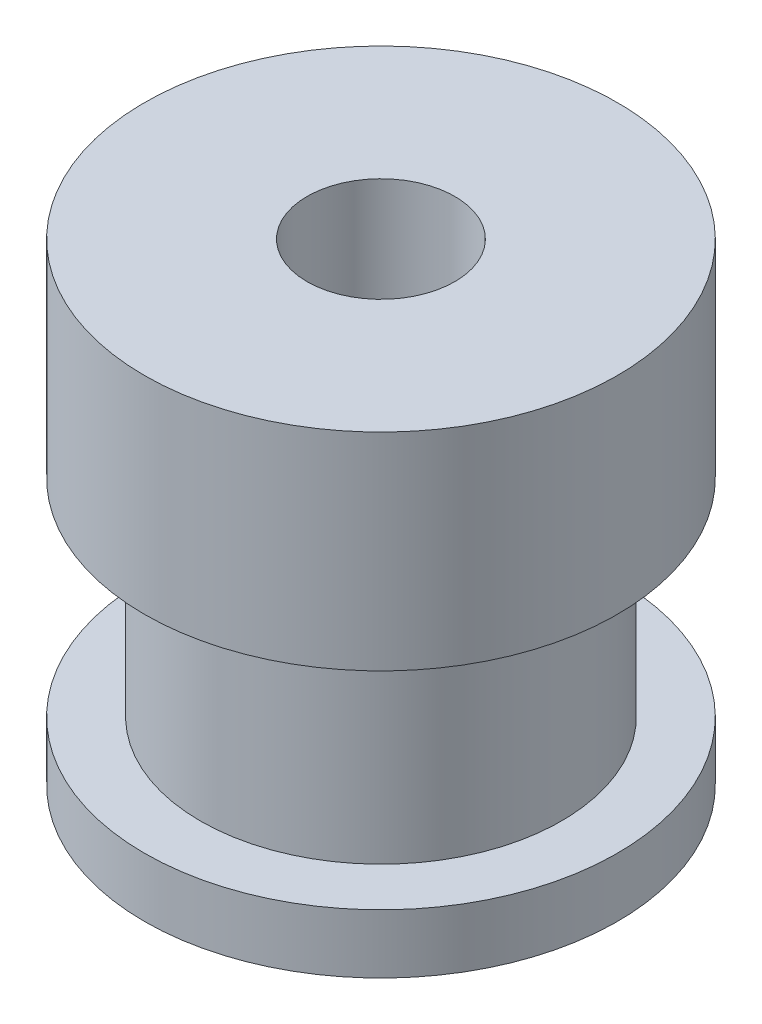
ISO-10303-21;
HEADER;
FILE_DESCRIPTION(('STEP AP214'),'2;1');
FILE_NAME('part.step','',(''),(''),'','','');
FILE_SCHEMA(('AUTOMOTIVE_DESIGN { 1 0 10303 214 1 1 1 1 }'));
ENDSEC;
DATA;
#1=APPLICATION_CONTEXT('core data for automotive mechanical design processes');
#2=APPLICATION_PROTOCOL_DEFINITION('international standard','automotive_design',2000,#1);
#3=PRODUCT_CONTEXT('',#1,'mechanical');
#4=PRODUCT('Part','Part','',(#3));
#5=PRODUCT_RELATED_PRODUCT_CATEGORY('part','',(#4));
#6=PRODUCT_DEFINITION_FORMATION('','',#4);
#7=PRODUCT_DEFINITION_CONTEXT('part definition',#1,'design');
#8=PRODUCT_DEFINITION('design','',#6,#7);
#9=PRODUCT_DEFINITION_SHAPE('','',#8);
#10=(LENGTH_UNIT() NAMED_UNIT(*) SI_UNIT(.MILLI.,.METRE.));
#11=(NAMED_UNIT(*) PLANE_ANGLE_UNIT() SI_UNIT($,.RADIAN.));
#12=(NAMED_UNIT(*) SI_UNIT($,.STERADIAN.) SOLID_ANGLE_UNIT());
#13=UNCERTAINTY_MEASURE_WITH_UNIT(LENGTH_MEASURE(1.E-05),#10,'distance_accuracy_value','');
#14=(GEOMETRIC_REPRESENTATION_CONTEXT(3) GLOBAL_UNCERTAINTY_ASSIGNED_CONTEXT((#13)) GLOBAL_UNIT_ASSIGNED_CONTEXT((#10,
#11,#12)) REPRESENTATION_CONTEXT('',''));
#15=CARTESIAN_POINT('',(0.,0.,0.));
#16=DIRECTION('',(0.,0.,1.));
#17=DIRECTION('',(1.,0.,0.));
#18=AXIS2_PLACEMENT_3D('',#15,#16,#17);
#19=CARTESIAN_POINT('',(0.,2.,0.));
#20=DIRECTION('',(0.,-1.,0.));
#21=DIRECTION('',(0.,0.,-1.));
#22=AXIS2_PLACEMENT_3D('',#19,#20,#21);
#23=CYLINDRICAL_SURFACE('',#22,8.);
#24=CARTESIAN_POINT('',(0.,2.,0.));
#25=DIRECTION('',(0.,1.,0.));
#26=DIRECTION('',(0.,0.,1.));
#27=AXIS2_PLACEMENT_3D('',#24,#25,#26);
#28=CIRCLE('',#27,8.);
#29=CARTESIAN_POINT('',(0.,2.,8.));
#30=VERTEX_POINT('',#29);
#31=EDGE_CURVE('E46',#30,#30,#28,.T.);
#32=ORIENTED_EDGE('',*,*,#31,.F.);
#33=EDGE_LOOP('',(#32));
#34=FACE_BOUND('',#33,.T.);
#35=CARTESIAN_POINT('',(0.,0.,0.));
#36=DIRECTION('',(0.,1.,0.));
#37=DIRECTION('',(0.,0.,1.));
#38=AXIS2_PLACEMENT_3D('',#35,#36,#37);
#39=CIRCLE('',#38,8.);
#40=CARTESIAN_POINT('',(0.,0.,8.));
#41=VERTEX_POINT('',#40);
#42=EDGE_CURVE('E42',#41,#41,#39,.T.);
#43=ORIENTED_EDGE('',*,*,#42,.T.);
#44=EDGE_LOOP('',(#43));
#45=FACE_BOUND('',#44,.T.);
#46=ADVANCED_FACE('F39',(#34,#45),#23,.T.);
#47=CARTESIAN_POINT('',(0.,2.,0.));
#48=DIRECTION('',(0.,1.,0.));
#49=DIRECTION('',(0.,0.,1.));
#50=AXIS2_PLACEMENT_3D('',#47,#48,#49);
#51=PLANE('',#50);
#52=CARTESIAN_POINT('',(0.,2.,0.));
#53=DIRECTION('',(0.,1.,0.));
#54=DIRECTION('',(0.,0.,1.));
#55=AXIS2_PLACEMENT_3D('',#52,#53,#54);
#56=CIRCLE('',#55,6.11);
#57=CARTESIAN_POINT('',(0.,2.,6.11));
#58=VERTEX_POINT('',#57);
#59=EDGE_CURVE('E10',#58,#58,#56,.T.);
#60=ORIENTED_EDGE('',*,*,#59,.F.);
#61=EDGE_LOOP('',(#60));
#62=FACE_BOUND('',#61,.T.);
#63=ORIENTED_EDGE('',*,*,#31,.T.);
#64=EDGE_LOOP('',(#63));
#65=FACE_BOUND('',#64,.T.);
#66=ADVANCED_FACE('F94',(#62,#65),#51,.T.);
#67=CARTESIAN_POINT('',(0.,0.,0.));
#68=DIRECTION('',(0.,1.,0.));
#69=DIRECTION('',(0.,0.,1.));
#70=AXIS2_PLACEMENT_3D('',#67,#68,#69);
#71=PLANE('',#70);
#72=CARTESIAN_POINT('',(0.,0.,0.));
#73=DIRECTION('',(0.,1.,0.));
#74=DIRECTION('',(0.,0.,1.));
#75=AXIS2_PLACEMENT_3D('',#72,#73,#74);
#76=CIRCLE('',#75,2.5);
#77=CARTESIAN_POINT('',(0.,0.,2.5));
#78=VERTEX_POINT('',#77);
#79=EDGE_CURVE('E59',#78,#78,#76,.T.);
#80=ORIENTED_EDGE('',*,*,#79,.T.);
#81=EDGE_LOOP('',(#80));
#82=FACE_BOUND('',#81,.T.);
#83=ORIENTED_EDGE('',*,*,#42,.F.);
#84=EDGE_LOOP('',(#83));
#85=FACE_BOUND('',#84,.T.);
#86=ADVANCED_FACE('F99',(#82,#85),#71,.F.);
#87=CARTESIAN_POINT('',(0.,9.,0.));
#88=DIRECTION('',(0.,-1.,0.));
#89=DIRECTION('',(0.,0.,-1.));
#90=AXIS2_PLACEMENT_3D('',#87,#88,#89);
#91=CYLINDRICAL_SURFACE('',#90,6.11);
#92=CARTESIAN_POINT('',(0.,9.,0.));
#93=DIRECTION('',(0.,1.,0.));
#94=DIRECTION('',(0.,0.,1.));
#95=AXIS2_PLACEMENT_3D('',#92,#93,#94);
#96=CIRCLE('',#95,6.11);
#97=CARTESIAN_POINT('',(0.,9.,6.11));
#98=VERTEX_POINT('',#97);
#99=EDGE_CURVE('E52',#98,#98,#96,.T.);
#100=ORIENTED_EDGE('',*,*,#99,.F.);
#101=EDGE_LOOP('',(#100));
#102=FACE_BOUND('',#101,.T.);
#103=ORIENTED_EDGE('',*,*,#59,.T.);
#104=EDGE_LOOP('',(#103));
#105=FACE_BOUND('',#104,.T.);
#106=ADVANCED_FACE('F81',(#102,#105),#91,.T.);
#107=CARTESIAN_POINT('',(0.,16.,0.));
#108=DIRECTION('',(0.,-1.,0.));
#109=DIRECTION('',(0.,0.,-1.));
#110=AXIS2_PLACEMENT_3D('',#107,#108,#109);
#111=CYLINDRICAL_SURFACE('',#110,8.);
#112=CARTESIAN_POINT('',(0.,16.,0.));
#113=DIRECTION('',(0.,1.,0.));
#114=DIRECTION('',(0.,0.,1.));
#115=AXIS2_PLACEMENT_3D('',#112,#113,#114);
#116=CIRCLE('',#115,8.);
#117=CARTESIAN_POINT('',(0.,16.,8.));
#118=VERTEX_POINT('',#117);
#119=EDGE_CURVE('E55',#118,#118,#116,.T.);
#120=ORIENTED_EDGE('',*,*,#119,.F.);
#121=EDGE_LOOP('',(#120));
#122=FACE_BOUND('',#121,.T.);
#123=CARTESIAN_POINT('',(0.,9.,0.));
#124=DIRECTION('',(0.,1.,0.));
#125=DIRECTION('',(0.,0.,1.));
#126=AXIS2_PLACEMENT_3D('',#123,#124,#125);
#127=CIRCLE('',#126,8.);
#128=CARTESIAN_POINT('',(0.,9.,8.));
#129=VERTEX_POINT('',#128);
#130=EDGE_CURVE('E56',#129,#129,#127,.T.);
#131=ORIENTED_EDGE('',*,*,#130,.T.);
#132=EDGE_LOOP('',(#131));
#133=FACE_BOUND('',#132,.T.);
#134=ADVANCED_FACE('F75',(#122,#133),#111,.T.);
#135=CARTESIAN_POINT('',(0.,16.,0.));
#136=DIRECTION('',(0.,1.,0.));
#137=DIRECTION('',(0.,0.,1.));
#138=AXIS2_PLACEMENT_3D('',#135,#136,#137);
#139=PLANE('',#138);
#140=CARTESIAN_POINT('',(0.,16.,0.));
#141=DIRECTION('',(0.,1.,0.));
#142=DIRECTION('',(0.,0.,1.));
#143=AXIS2_PLACEMENT_3D('',#140,#141,#142);
#144=CIRCLE('',#143,2.5);
#145=CARTESIAN_POINT('',(0.,16.,2.5));
#146=VERTEX_POINT('',#145);
#147=EDGE_CURVE('E64',#146,#146,#144,.T.);
#148=ORIENTED_EDGE('',*,*,#147,.F.);
#149=EDGE_LOOP('',(#148));
#150=FACE_BOUND('',#149,.T.);
#151=ORIENTED_EDGE('',*,*,#119,.T.);
#152=EDGE_LOOP('',(#151));
#153=FACE_BOUND('',#152,.T.);
#154=ADVANCED_FACE('F71',(#150,#153),#139,.T.);
#155=CARTESIAN_POINT('',(0.,9.,0.));
#156=DIRECTION('',(0.,1.,0.));
#157=DIRECTION('',(0.,0.,1.));
#158=AXIS2_PLACEMENT_3D('',#155,#156,#157);
#159=PLANE('',#158);
#160=ORIENTED_EDGE('',*,*,#99,.T.);
#161=EDGE_LOOP('',(#160));
#162=FACE_BOUND('',#161,.T.);
#163=ORIENTED_EDGE('',*,*,#130,.F.);
#164=EDGE_LOOP('',(#163));
#165=FACE_BOUND('',#164,.T.);
#166=ADVANCED_FACE('F74',(#162,#165),#159,.F.);
#167=CARTESIAN_POINT('',(0.,-8.,0.));
#168=DIRECTION('',(0.,1.,0.));
#169=DIRECTION('',(0.,0.,1.));
#170=AXIS2_PLACEMENT_3D('',#167,#168,#169);
#171=CYLINDRICAL_SURFACE('',#170,2.5);
#172=ORIENTED_EDGE('',*,*,#147,.T.);
#173=EDGE_LOOP('',(#172));
#174=FACE_BOUND('',#173,.T.);
#175=ORIENTED_EDGE('',*,*,#79,.F.);
#176=EDGE_LOOP('',(#175));
#177=FACE_BOUND('',#176,.T.);
#178=ADVANCED_FACE('F68',(#174,#177),#171,.F.);
#179=CLOSED_SHELL('',(#46,#66,#86,#106,#134,#154,#166,#178));
#180=MANIFOLD_SOLID_BREP('B2',#179);
#181=ADVANCED_BREP_SHAPE_REPRESENTATION('',(#18,#180),#14);
#182=SHAPE_DEFINITION_REPRESENTATION(#9,#181);
ENDSEC;
END-ISO-10303-21;
